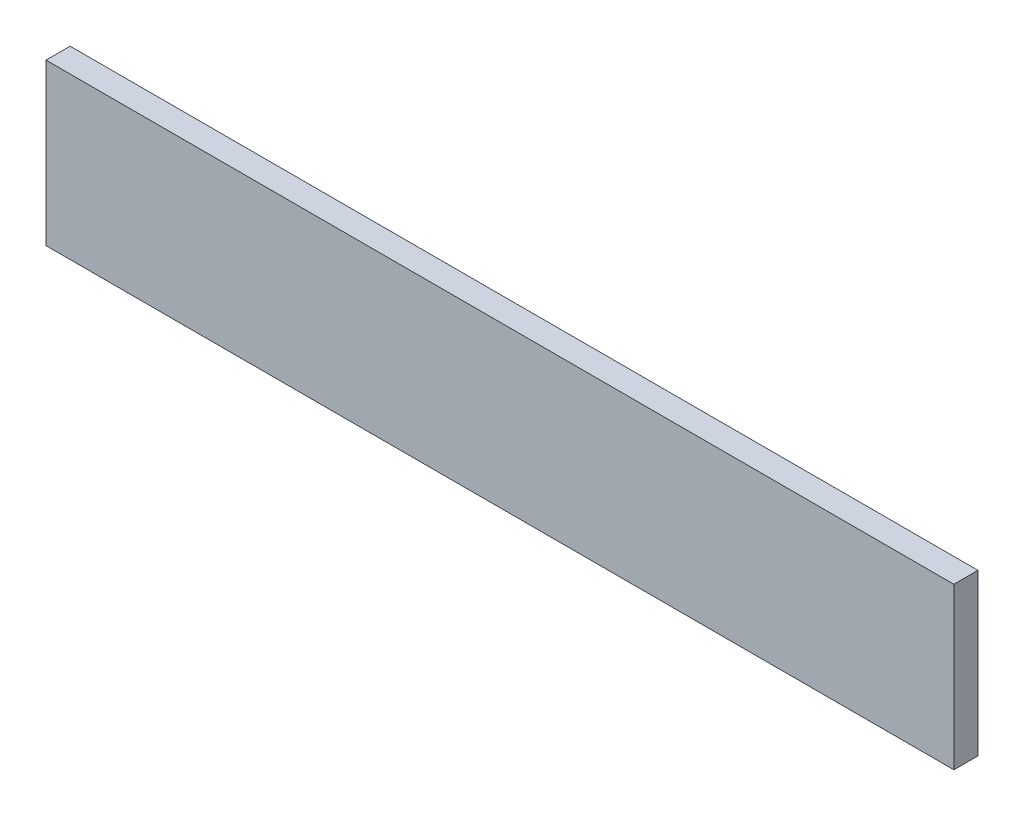
ISO-10303-21;
HEADER;
FILE_DESCRIPTION(('STEP AP214'),'2;1');
FILE_NAME('part.step','',(''),(''),'','','');
FILE_SCHEMA(('AUTOMOTIVE_DESIGN { 1 0 10303 214 1 1 1 1 }'));
ENDSEC;
DATA;
#1=APPLICATION_CONTEXT('core data for automotive mechanical design processes');
#2=APPLICATION_PROTOCOL_DEFINITION('international standard','automotive_design',2000,#1);
#3=PRODUCT_CONTEXT('',#1,'mechanical');
#4=PRODUCT('Part','Part','',(#3));
#5=PRODUCT_RELATED_PRODUCT_CATEGORY('part','',(#4));
#6=PRODUCT_DEFINITION_FORMATION('','',#4);
#7=PRODUCT_DEFINITION_CONTEXT('part definition',#1,'design');
#8=PRODUCT_DEFINITION('design','',#6,#7);
#9=PRODUCT_DEFINITION_SHAPE('','',#8);
#10=(LENGTH_UNIT() NAMED_UNIT(*) SI_UNIT(.MILLI.,.METRE.));
#11=(NAMED_UNIT(*) PLANE_ANGLE_UNIT() SI_UNIT($,.RADIAN.));
#12=(NAMED_UNIT(*) SI_UNIT($,.STERADIAN.) SOLID_ANGLE_UNIT());
#13=UNCERTAINTY_MEASURE_WITH_UNIT(LENGTH_MEASURE(1.E-05),#10,'distance_accuracy_value','');
#14=(GEOMETRIC_REPRESENTATION_CONTEXT(3) GLOBAL_UNCERTAINTY_ASSIGNED_CONTEXT((#13)) GLOBAL_UNIT_ASSIGNED_CONTEXT((#10,
#11,#12)) REPRESENTATION_CONTEXT('',''));
#15=CARTESIAN_POINT('',(0.,0.,0.));
#16=DIRECTION('',(0.,0.,1.));
#17=DIRECTION('',(1.,0.,0.));
#18=AXIS2_PLACEMENT_3D('',#15,#16,#17);
#19=CARTESIAN_POINT('',(0.,0.,19.05));
#20=DIRECTION('',(1.,0.,0.));
#21=DIRECTION('',(0.,0.,-1.));
#22=AXIS2_PLACEMENT_3D('',#19,#20,#21);
#23=PLANE('',#22);
#24=DIRECTION('',(0.,-1.,0.));
#25=VECTOR('',#24,1.);
#26=CARTESIAN_POINT('',(0.,0.,0.));
#27=LINE('',#26,#25);
#28=CARTESIAN_POINT('',(0.,127.,0.));
#29=VERTEX_POINT('',#28);
#30=CARTESIAN_POINT('',(0.,0.,0.));
#31=VERTEX_POINT('',#30);
#32=EDGE_CURVE('E113',#29,#31,#27,.T.);
#33=ORIENTED_EDGE('',*,*,#32,.T.);
#34=DIRECTION('',(0.,0.,-1.));
#35=VECTOR('',#34,1.);
#36=CARTESIAN_POINT('',(0.,0.,19.05));
#37=LINE('',#36,#35);
#38=CARTESIAN_POINT('',(0.,0.,19.05));
#39=VERTEX_POINT('',#38);
#40=EDGE_CURVE('E11',#39,#31,#37,.T.);
#41=ORIENTED_EDGE('',*,*,#40,.F.);
#42=DIRECTION('',(0.,-1.,0.));
#43=VECTOR('',#42,1.);
#44=CARTESIAN_POINT('',(0.,0.,19.05));
#45=LINE('',#44,#43);
#46=CARTESIAN_POINT('',(0.,127.,19.05));
#47=VERTEX_POINT('',#46);
#48=EDGE_CURVE('E97',#47,#39,#45,.T.);
#49=ORIENTED_EDGE('',*,*,#48,.F.);
#50=DIRECTION('',(0.,0.,-1.));
#51=VECTOR('',#50,1.);
#52=CARTESIAN_POINT('',(0.,127.,19.05));
#53=LINE('',#52,#51);
#54=EDGE_CURVE('E109',#47,#29,#53,.T.);
#55=ORIENTED_EDGE('',*,*,#54,.T.);
#56=EDGE_LOOP('',(#33,#41,#49,#55));
#57=FACE_BOUND('',#56,.T.);
#58=ADVANCED_FACE('F45',(#57),#23,.F.);
#59=CARTESIAN_POINT('',(0.,0.,19.05));
#60=DIRECTION('',(0.,1.,0.));
#61=DIRECTION('',(0.,0.,1.));
#62=AXIS2_PLACEMENT_3D('',#59,#60,#61);
#63=PLANE('',#62);
#64=DIRECTION('',(1.,0.,0.));
#65=VECTOR('',#64,1.);
#66=CARTESIAN_POINT('',(0.,0.,0.));
#67=LINE('',#66,#65);
#68=CARTESIAN_POINT('',(717.55,0.,0.));
#69=VERTEX_POINT('',#68);
#70=EDGE_CURVE('E102',#31,#69,#67,.T.);
#71=ORIENTED_EDGE('',*,*,#70,.T.);
#72=DIRECTION('',(0.,0.,-1.));
#73=VECTOR('',#72,1.);
#74=CARTESIAN_POINT('',(717.55,0.,19.05));
#75=LINE('',#74,#73);
#76=CARTESIAN_POINT('',(717.55,0.,19.05));
#77=VERTEX_POINT('',#76);
#78=EDGE_CURVE('E54',#77,#69,#75,.T.);
#79=ORIENTED_EDGE('',*,*,#78,.F.);
#80=DIRECTION('',(1.,0.,0.));
#81=VECTOR('',#80,1.);
#82=CARTESIAN_POINT('',(0.,0.,19.05));
#83=LINE('',#82,#81);
#84=EDGE_CURVE('E92',#39,#77,#83,.T.);
#85=ORIENTED_EDGE('',*,*,#84,.F.);
#86=ORIENTED_EDGE('',*,*,#40,.T.);
#87=EDGE_LOOP('',(#71,#79,#85,#86));
#88=FACE_BOUND('',#87,.T.);
#89=ADVANCED_FACE('F101',(#88),#63,.F.);
#90=CARTESIAN_POINT('',(717.55,0.,19.05));
#91=DIRECTION('',(-1.,0.,0.));
#92=DIRECTION('',(0.,0.,1.));
#93=AXIS2_PLACEMENT_3D('',#90,#91,#92);
#94=PLANE('',#93);
#95=DIRECTION('',(0.,1.,0.));
#96=VECTOR('',#95,1.);
#97=CARTESIAN_POINT('',(717.55,0.,0.));
#98=LINE('',#97,#96);
#99=CARTESIAN_POINT('',(717.55,127.,0.));
#100=VERTEX_POINT('',#99);
#101=EDGE_CURVE('E79',#69,#100,#98,.T.);
#102=ORIENTED_EDGE('',*,*,#101,.T.);
#103=DIRECTION('',(0.,0.,-1.));
#104=VECTOR('',#103,1.);
#105=CARTESIAN_POINT('',(717.55,127.,19.05));
#106=LINE('',#105,#104);
#107=CARTESIAN_POINT('',(717.55,127.,19.05));
#108=VERTEX_POINT('',#107);
#109=EDGE_CURVE('E104',#108,#100,#106,.T.);
#110=ORIENTED_EDGE('',*,*,#109,.F.);
#111=DIRECTION('',(0.,1.,0.));
#112=VECTOR('',#111,1.);
#113=CARTESIAN_POINT('',(717.55,0.,19.05));
#114=LINE('',#113,#112);
#115=EDGE_CURVE('E95',#77,#108,#114,.T.);
#116=ORIENTED_EDGE('',*,*,#115,.F.);
#117=ORIENTED_EDGE('',*,*,#78,.T.);
#118=EDGE_LOOP('',(#102,#110,#116,#117));
#119=FACE_BOUND('',#118,.T.);
#120=ADVANCED_FACE('F105',(#119),#94,.F.);
#121=CARTESIAN_POINT('',(0.,127.,19.05));
#122=DIRECTION('',(0.,-1.,0.));
#123=DIRECTION('',(0.,0.,-1.));
#124=AXIS2_PLACEMENT_3D('',#121,#122,#123);
#125=PLANE('',#124);
#126=DIRECTION('',(-1.,0.,0.));
#127=VECTOR('',#126,1.);
#128=CARTESIAN_POINT('',(0.,127.,0.));
#129=LINE('',#128,#127);
#130=EDGE_CURVE('E85',#100,#29,#129,.T.);
#131=ORIENTED_EDGE('',*,*,#130,.T.);
#132=ORIENTED_EDGE('',*,*,#54,.F.);
#133=DIRECTION('',(-1.,0.,0.));
#134=VECTOR('',#133,1.);
#135=CARTESIAN_POINT('',(0.,127.,19.05));
#136=LINE('',#135,#134);
#137=EDGE_CURVE('E62',#108,#47,#136,.T.);
#138=ORIENTED_EDGE('',*,*,#137,.F.);
#139=ORIENTED_EDGE('',*,*,#109,.T.);
#140=EDGE_LOOP('',(#131,#132,#138,#139));
#141=FACE_BOUND('',#140,.T.);
#142=ADVANCED_FACE('F126',(#141),#125,.F.);
#143=CARTESIAN_POINT('',(0.,0.,19.05));
#144=DIRECTION('',(0.,0.,-1.));
#145=DIRECTION('',(-1.,0.,0.));
#146=AXIS2_PLACEMENT_3D('',#143,#144,#145);
#147=PLANE('',#146);
#148=ORIENTED_EDGE('',*,*,#48,.T.);
#149=ORIENTED_EDGE('',*,*,#84,.T.);
#150=ORIENTED_EDGE('',*,*,#115,.T.);
#151=ORIENTED_EDGE('',*,*,#137,.T.);
#152=EDGE_LOOP('',(#148,#149,#150,#151));
#153=FACE_BOUND('',#152,.T.);
#154=ADVANCED_FACE('F93',(#153),#147,.F.);
#155=CARTESIAN_POINT('',(0.,0.,0.));
#156=DIRECTION('',(0.,0.,-1.));
#157=DIRECTION('',(-1.,0.,0.));
#158=AXIS2_PLACEMENT_3D('',#155,#156,#157);
#159=PLANE('',#158);
#160=ORIENTED_EDGE('',*,*,#32,.F.);
#161=ORIENTED_EDGE('',*,*,#130,.F.);
#162=ORIENTED_EDGE('',*,*,#101,.F.);
#163=ORIENTED_EDGE('',*,*,#70,.F.);
#164=EDGE_LOOP('',(#160,#161,#162,#163));
#165=FACE_BOUND('',#164,.T.);
#166=ADVANCED_FACE('F129',(#165),#159,.T.);
#167=CLOSED_SHELL('',(#58,#89,#120,#142,#154,#166));
#168=MANIFOLD_SOLID_BREP('B2',#167);
#169=ADVANCED_BREP_SHAPE_REPRESENTATION('',(#18,#168),#14);
#170=SHAPE_DEFINITION_REPRESENTATION(#9,#169);
ENDSEC;
END-ISO-10303-21;
